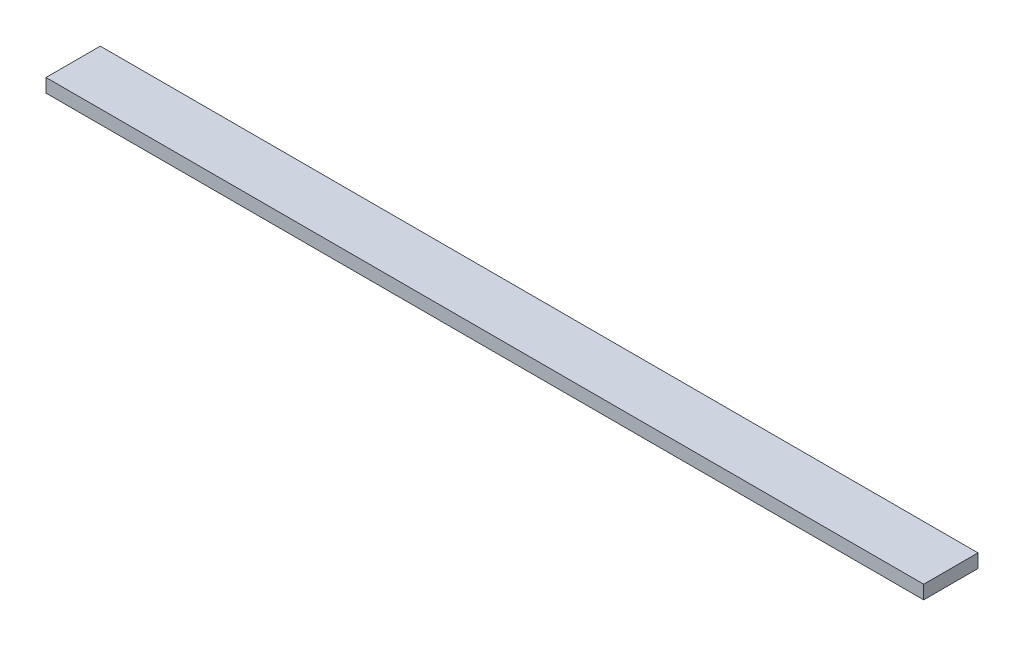
ISO-10303-21;
HEADER;
FILE_DESCRIPTION(('STEP AP214'),'2;1');
FILE_NAME('part.step','',(''),(''),'','','');
FILE_SCHEMA(('AUTOMOTIVE_DESIGN { 1 0 10303 214 1 1 1 1 }'));
ENDSEC;
DATA;
#1=APPLICATION_CONTEXT('core data for automotive mechanical design processes');
#2=APPLICATION_PROTOCOL_DEFINITION('international standard','automotive_design',2000,#1);
#3=PRODUCT_CONTEXT('',#1,'mechanical');
#4=PRODUCT('Part','Part','',(#3));
#5=PRODUCT_RELATED_PRODUCT_CATEGORY('part','',(#4));
#6=PRODUCT_DEFINITION_FORMATION('','',#4);
#7=PRODUCT_DEFINITION_CONTEXT('part definition',#1,'design');
#8=PRODUCT_DEFINITION('design','',#6,#7);
#9=PRODUCT_DEFINITION_SHAPE('','',#8);
#10=(LENGTH_UNIT() NAMED_UNIT(*) SI_UNIT(.MILLI.,.METRE.));
#11=(NAMED_UNIT(*) PLANE_ANGLE_UNIT() SI_UNIT($,.RADIAN.));
#12=(NAMED_UNIT(*) SI_UNIT($,.STERADIAN.) SOLID_ANGLE_UNIT());
#13=UNCERTAINTY_MEASURE_WITH_UNIT(LENGTH_MEASURE(1.E-05),#10,'distance_accuracy_value','');
#14=(GEOMETRIC_REPRESENTATION_CONTEXT(3) GLOBAL_UNCERTAINTY_ASSIGNED_CONTEXT((#13)) GLOBAL_UNIT_ASSIGNED_CONTEXT((#10,
#11,#12)) REPRESENTATION_CONTEXT('',''));
#15=CARTESIAN_POINT('',(0.,0.,0.));
#16=DIRECTION('',(0.,0.,1.));
#17=DIRECTION('',(1.,0.,0.));
#18=AXIS2_PLACEMENT_3D('',#15,#16,#17);
#19=CARTESIAN_POINT('',(0.,3.,0.));
#20=DIRECTION('',(1.,0.,0.));
#21=DIRECTION('',(0.,0.,-1.));
#22=AXIS2_PLACEMENT_3D('',#19,#20,#21);
#23=PLANE('',#22);
#24=DIRECTION('',(0.,0.,1.));
#25=VECTOR('',#24,1.);
#26=CARTESIAN_POINT('',(0.,0.,0.));
#27=LINE('',#26,#25);
#28=CARTESIAN_POINT('',(0.,0.,-12.));
#29=VERTEX_POINT('',#28);
#30=CARTESIAN_POINT('',(0.,0.,0.));
#31=VERTEX_POINT('',#30);
#32=EDGE_CURVE('E96',#29,#31,#27,.T.);
#33=ORIENTED_EDGE('',*,*,#32,.T.);
#34=DIRECTION('',(0.,-1.,0.));
#35=VECTOR('',#34,1.);
#36=CARTESIAN_POINT('',(0.,3.,0.));
#37=LINE('',#36,#35);
#38=CARTESIAN_POINT('',(0.,3.,0.));
#39=VERTEX_POINT('',#38);
#40=EDGE_CURVE('E11',#39,#31,#37,.T.);
#41=ORIENTED_EDGE('',*,*,#40,.F.);
#42=DIRECTION('',(0.,0.,1.));
#43=VECTOR('',#42,1.);
#44=CARTESIAN_POINT('',(0.,3.,0.));
#45=LINE('',#44,#43);
#46=CARTESIAN_POINT('',(0.,3.,-12.));
#47=VERTEX_POINT('',#46);
#48=EDGE_CURVE('E84',#47,#39,#45,.T.);
#49=ORIENTED_EDGE('',*,*,#48,.F.);
#50=DIRECTION('',(0.,-1.,0.));
#51=VECTOR('',#50,1.);
#52=CARTESIAN_POINT('',(0.,3.,-12.));
#53=LINE('',#52,#51);
#54=EDGE_CURVE('E92',#47,#29,#53,.T.);
#55=ORIENTED_EDGE('',*,*,#54,.T.);
#56=EDGE_LOOP('',(#33,#41,#49,#55));
#57=FACE_BOUND('',#56,.T.);
#58=ADVANCED_FACE('F33',(#57),#23,.F.);
#59=CARTESIAN_POINT('',(0.,3.,0.));
#60=DIRECTION('',(0.,0.,-1.));
#61=DIRECTION('',(-1.,0.,0.));
#62=AXIS2_PLACEMENT_3D('',#59,#60,#61);
#63=PLANE('',#62);
#64=DIRECTION('',(1.,0.,0.));
#65=VECTOR('',#64,1.);
#66=CARTESIAN_POINT('',(0.,0.,0.));
#67=LINE('',#66,#65);
#68=CARTESIAN_POINT('',(194.,0.,0.));
#69=VERTEX_POINT('',#68);
#70=EDGE_CURVE('E88',#31,#69,#67,.T.);
#71=ORIENTED_EDGE('',*,*,#70,.T.);
#72=DIRECTION('',(0.,-1.,0.));
#73=VECTOR('',#72,1.);
#74=CARTESIAN_POINT('',(194.,3.,0.));
#75=LINE('',#74,#73);
#76=CARTESIAN_POINT('',(194.,3.,0.));
#77=VERTEX_POINT('',#76);
#78=EDGE_CURVE('E41',#77,#69,#75,.T.);
#79=ORIENTED_EDGE('',*,*,#78,.F.);
#80=DIRECTION('',(1.,0.,0.));
#81=VECTOR('',#80,1.);
#82=CARTESIAN_POINT('',(0.,3.,0.));
#83=LINE('',#82,#81);
#84=EDGE_CURVE('E79',#39,#77,#83,.T.);
#85=ORIENTED_EDGE('',*,*,#84,.F.);
#86=ORIENTED_EDGE('',*,*,#40,.T.);
#87=EDGE_LOOP('',(#71,#79,#85,#86));
#88=FACE_BOUND('',#87,.T.);
#89=ADVANCED_FACE('F87',(#88),#63,.F.);
#90=CARTESIAN_POINT('',(194.,3.,0.));
#91=DIRECTION('',(-1.,0.,0.));
#92=DIRECTION('',(0.,0.,1.));
#93=AXIS2_PLACEMENT_3D('',#90,#91,#92);
#94=PLANE('',#93);
#95=DIRECTION('',(0.,0.,-1.));
#96=VECTOR('',#95,1.);
#97=CARTESIAN_POINT('',(194.,0.,0.));
#98=LINE('',#97,#96);
#99=CARTESIAN_POINT('',(194.,0.,-12.));
#100=VERTEX_POINT('',#99);
#101=EDGE_CURVE('E66',#69,#100,#98,.T.);
#102=ORIENTED_EDGE('',*,*,#101,.T.);
#103=DIRECTION('',(0.,-1.,0.));
#104=VECTOR('',#103,1.);
#105=CARTESIAN_POINT('',(194.,3.,-12.));
#106=LINE('',#105,#104);
#107=CARTESIAN_POINT('',(194.,3.,-12.));
#108=VERTEX_POINT('',#107);
#109=EDGE_CURVE('E89',#108,#100,#106,.T.);
#110=ORIENTED_EDGE('',*,*,#109,.F.);
#111=DIRECTION('',(0.,0.,-1.));
#112=VECTOR('',#111,1.);
#113=CARTESIAN_POINT('',(194.,3.,0.));
#114=LINE('',#113,#112);
#115=EDGE_CURVE('E82',#77,#108,#114,.T.);
#116=ORIENTED_EDGE('',*,*,#115,.F.);
#117=ORIENTED_EDGE('',*,*,#78,.T.);
#118=EDGE_LOOP('',(#102,#110,#116,#117));
#119=FACE_BOUND('',#118,.T.);
#120=ADVANCED_FACE('F90',(#119),#94,.F.);
#121=CARTESIAN_POINT('',(0.,3.,-12.));
#122=DIRECTION('',(0.,0.,1.));
#123=DIRECTION('',(1.,0.,0.));
#124=AXIS2_PLACEMENT_3D('',#121,#122,#123);
#125=PLANE('',#124);
#126=DIRECTION('',(-1.,0.,0.));
#127=VECTOR('',#126,1.);
#128=CARTESIAN_POINT('',(0.,0.,-12.));
#129=LINE('',#128,#127);
#130=EDGE_CURVE('E72',#100,#29,#129,.T.);
#131=ORIENTED_EDGE('',*,*,#130,.T.);
#132=ORIENTED_EDGE('',*,*,#54,.F.);
#133=DIRECTION('',(-1.,0.,0.));
#134=VECTOR('',#133,1.);
#135=CARTESIAN_POINT('',(0.,3.,-12.));
#136=LINE('',#135,#134);
#137=EDGE_CURVE('E49',#108,#47,#136,.T.);
#138=ORIENTED_EDGE('',*,*,#137,.F.);
#139=ORIENTED_EDGE('',*,*,#109,.T.);
#140=EDGE_LOOP('',(#131,#132,#138,#139));
#141=FACE_BOUND('',#140,.T.);
#142=ADVANCED_FACE('F103',(#141),#125,.F.);
#143=CARTESIAN_POINT('',(0.,3.,0.));
#144=DIRECTION('',(0.,-1.,0.));
#145=DIRECTION('',(0.,0.,-1.));
#146=AXIS2_PLACEMENT_3D('',#143,#144,#145);
#147=PLANE('',#146);
#148=ORIENTED_EDGE('',*,*,#48,.T.);
#149=ORIENTED_EDGE('',*,*,#84,.T.);
#150=ORIENTED_EDGE('',*,*,#115,.T.);
#151=ORIENTED_EDGE('',*,*,#137,.T.);
#152=EDGE_LOOP('',(#148,#149,#150,#151));
#153=FACE_BOUND('',#152,.T.);
#154=ADVANCED_FACE('F80',(#153),#147,.F.);
#155=CARTESIAN_POINT('',(0.,0.,0.));
#156=DIRECTION('',(0.,-1.,0.));
#157=DIRECTION('',(0.,0.,-1.));
#158=AXIS2_PLACEMENT_3D('',#155,#156,#157);
#159=PLANE('',#158);
#160=ORIENTED_EDGE('',*,*,#32,.F.);
#161=ORIENTED_EDGE('',*,*,#130,.F.);
#162=ORIENTED_EDGE('',*,*,#101,.F.);
#163=ORIENTED_EDGE('',*,*,#70,.F.);
#164=EDGE_LOOP('',(#160,#161,#162,#163));
#165=FACE_BOUND('',#164,.T.);
#166=ADVANCED_FACE('F106',(#165),#159,.T.);
#167=CLOSED_SHELL('',(#58,#89,#120,#142,#154,#166));
#168=MANIFOLD_SOLID_BREP('B2',#167);
#169=ADVANCED_BREP_SHAPE_REPRESENTATION('',(#18,#168),#14);
#170=SHAPE_DEFINITION_REPRESENTATION(#9,#169);
ENDSEC;
END-ISO-10303-21;
